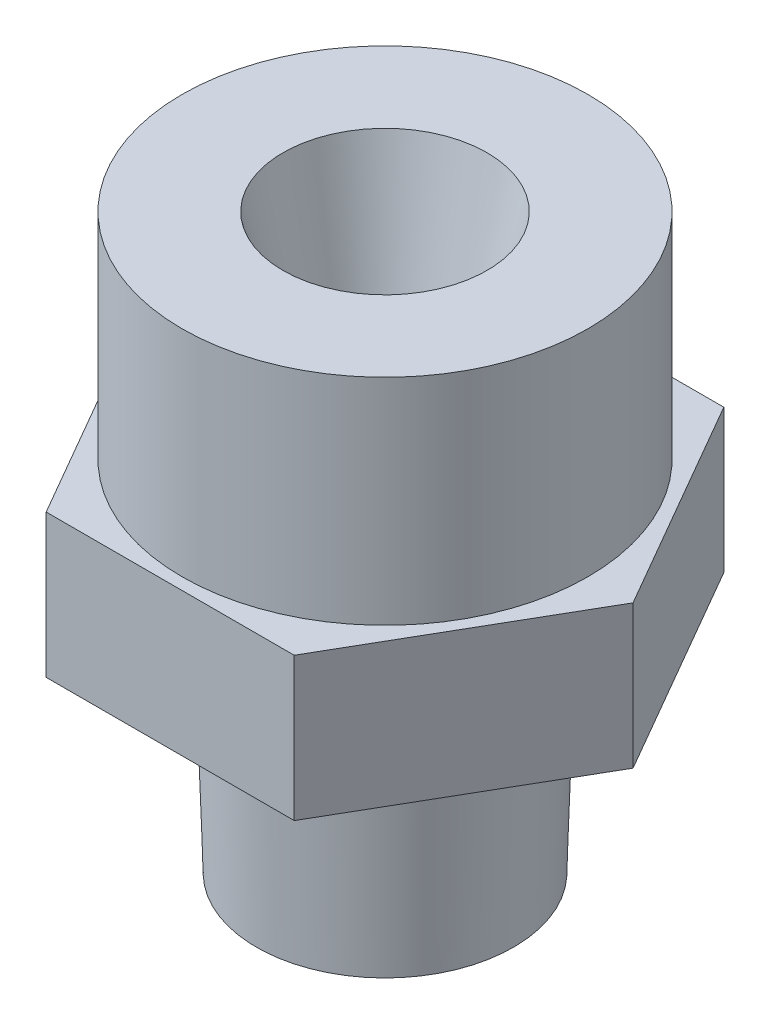
ISO-10303-21;
HEADER;
FILE_DESCRIPTION(('STEP AP214'),'2;1');
FILE_NAME('part.step','',(''),(''),'','','');
FILE_SCHEMA(('AUTOMOTIVE_DESIGN { 1 0 10303 214 1 1 1 1 }'));
ENDSEC;
DATA;
#1=APPLICATION_CONTEXT('core data for automotive mechanical design processes');
#2=APPLICATION_PROTOCOL_DEFINITION('international standard','automotive_design',2000,#1);
#3=PRODUCT_CONTEXT('',#1,'mechanical');
#4=PRODUCT('Part','Part','',(#3));
#5=PRODUCT_RELATED_PRODUCT_CATEGORY('part','',(#4));
#6=PRODUCT_DEFINITION_FORMATION('','',#4);
#7=PRODUCT_DEFINITION_CONTEXT('part definition',#1,'design');
#8=PRODUCT_DEFINITION('design','',#6,#7);
#9=PRODUCT_DEFINITION_SHAPE('','',#8);
#10=(LENGTH_UNIT() NAMED_UNIT(*) SI_UNIT(.MILLI.,.METRE.));
#11=(NAMED_UNIT(*) PLANE_ANGLE_UNIT() SI_UNIT($,.RADIAN.));
#12=(NAMED_UNIT(*) SI_UNIT($,.STERADIAN.) SOLID_ANGLE_UNIT());
#13=UNCERTAINTY_MEASURE_WITH_UNIT(LENGTH_MEASURE(1.E-05),#10,'distance_accuracy_value','');
#14=(GEOMETRIC_REPRESENTATION_CONTEXT(3) GLOBAL_UNCERTAINTY_ASSIGNED_CONTEXT((#13)) GLOBAL_UNIT_ASSIGNED_CONTEXT((#10,
#11,#12)) REPRESENTATION_CONTEXT('',''));
#15=CARTESIAN_POINT('',(0.,0.,0.));
#16=DIRECTION('',(0.,0.,1.));
#17=DIRECTION('',(1.,0.,0.));
#18=AXIS2_PLACEMENT_3D('',#15,#16,#17);
#19=CARTESIAN_POINT('',(0.,9.525,0.));
#20=DIRECTION('',(0.,-1.,0.));
#21=DIRECTION('',(0.,0.,-1.));
#22=AXIS2_PLACEMENT_3D('',#19,#20,#21);
#23=CYLINDRICAL_SURFACE('',#22,9.);
#24=CARTESIAN_POINT('',(0.,9.525,0.));
#25=DIRECTION('',(0.,1.,0.));
#26=DIRECTION('',(0.,0.,1.));
#27=AXIS2_PLACEMENT_3D('',#24,#25,#26);
#28=CIRCLE('',#27,9.);
#29=CARTESIAN_POINT('',(0.,9.525,-9.));
#30=VERTEX_POINT('',#29);
#31=EDGE_CURVE('E11',#30,#30,#28,.T.);
#32=CARTESIAN_POINT('',(0.,0.,0.));
#33=DIRECTION('',(0.,1.,0.));
#34=DIRECTION('',(0.,0.,1.));
#35=AXIS2_PLACEMENT_3D('',#32,#33,#34);
#36=CIRCLE('',#35,9.);
#37=CARTESIAN_POINT('',(0.,0.,-9.));
#38=VERTEX_POINT('',#37);
#39=EDGE_CURVE('E42',#38,#38,#36,.T.);
#40=CARTESIAN_POINT('',(0.,9.525,-9.));
#41=CARTESIAN_POINT('',(0.,9.42578125,-9.));
#42=CARTESIAN_POINT('',(0.,9.3265625,-9.));
#43=CARTESIAN_POINT('',(0.,9.128125,-9.));
#44=CARTESIAN_POINT('',(0.,9.02890625,-9.));
#45=CARTESIAN_POINT('',(0.,8.83046875,-9.));
#46=CARTESIAN_POINT('',(0.,8.73125,-9.));
#47=CARTESIAN_POINT('',(0.,8.5328125,-9.));
#48=CARTESIAN_POINT('',(0.,8.43359375,-9.));
#49=CARTESIAN_POINT('',(0.,8.23515625,-9.));
#50=CARTESIAN_POINT('',(0.,8.1359375,-9.));
#51=CARTESIAN_POINT('',(0.,7.9375,-9.));
#52=CARTESIAN_POINT('',(0.,7.83828125,-9.));
#53=CARTESIAN_POINT('',(0.,7.63984375,-9.));
#54=CARTESIAN_POINT('',(0.,7.540625,-9.));
#55=CARTESIAN_POINT('',(0.,7.3421875,-9.));
#56=CARTESIAN_POINT('',(0.,7.24296875,-9.));
#57=CARTESIAN_POINT('',(0.,7.04453125,-9.));
#58=CARTESIAN_POINT('',(0.,6.9453125,-9.));
#59=CARTESIAN_POINT('',(0.,6.746875,-9.));
#60=CARTESIAN_POINT('',(0.,6.64765625,-9.));
#61=CARTESIAN_POINT('',(0.,6.44921875,-9.));
#62=CARTESIAN_POINT('',(0.,6.35,-9.));
#63=CARTESIAN_POINT('',(0.,6.1515625,-9.));
#64=CARTESIAN_POINT('',(0.,6.05234375,-9.));
#65=CARTESIAN_POINT('',(0.,5.85390625,-9.));
#66=CARTESIAN_POINT('',(0.,5.7546875,-9.));
#67=CARTESIAN_POINT('',(0.,5.55625,-9.));
#68=CARTESIAN_POINT('',(0.,5.45703125,-9.));
#69=CARTESIAN_POINT('',(0.,5.25859375,-9.));
#70=CARTESIAN_POINT('',(0.,5.159375,-9.));
#71=CARTESIAN_POINT('',(0.,4.9609375,-9.));
#72=CARTESIAN_POINT('',(0.,4.86171875,-9.));
#73=CARTESIAN_POINT('',(0.,4.66328125,-9.));
#74=CARTESIAN_POINT('',(0.,4.5640625,-9.));
#75=CARTESIAN_POINT('',(0.,4.365625,-9.));
#76=CARTESIAN_POINT('',(0.,4.26640625,-9.));
#77=CARTESIAN_POINT('',(0.,4.06796875,-9.));
#78=CARTESIAN_POINT('',(0.,3.96875,-9.));
#79=CARTESIAN_POINT('',(0.,3.7703125,-9.));
#80=CARTESIAN_POINT('',(0.,3.67109375,-9.));
#81=CARTESIAN_POINT('',(0.,3.47265625,-9.));
#82=CARTESIAN_POINT('',(0.,3.3734375,-9.));
#83=CARTESIAN_POINT('',(0.,3.175,-9.));
#84=CARTESIAN_POINT('',(0.,3.07578125,-9.));
#85=CARTESIAN_POINT('',(0.,2.87734375,-9.));
#86=CARTESIAN_POINT('',(0.,2.778125,-9.));
#87=CARTESIAN_POINT('',(0.,2.5796875,-9.));
#88=CARTESIAN_POINT('',(0.,2.48046875,-9.));
#89=CARTESIAN_POINT('',(0.,2.28203125,-9.));
#90=CARTESIAN_POINT('',(0.,2.1828125,-9.));
#91=CARTESIAN_POINT('',(0.,1.984375,-9.));
#92=CARTESIAN_POINT('',(0.,1.88515625,-9.));
#93=CARTESIAN_POINT('',(0.,1.68671875,-9.));
#94=CARTESIAN_POINT('',(0.,1.5875,-9.));
#95=CARTESIAN_POINT('',(0.,1.3890625,-9.));
#96=CARTESIAN_POINT('',(0.,1.28984375,-9.));
#97=CARTESIAN_POINT('',(0.,1.09140625,-9.));
#98=CARTESIAN_POINT('',(0.,0.992187500000001,-9.));
#99=CARTESIAN_POINT('',(0.,0.793750000000001,-9.));
#100=CARTESIAN_POINT('',(0.,0.69453125,-9.));
#101=CARTESIAN_POINT('',(0.,0.49609375,-9.));
#102=CARTESIAN_POINT('',(0.,0.396875,-9.));
#103=CARTESIAN_POINT('',(0.,0.1984375,-9.));
#104=CARTESIAN_POINT('',(0.,0.0992187500000001,-9.));
#105=CARTESIAN_POINT('',(0.,0.,-9.));
#106=B_SPLINE_CURVE_WITH_KNOTS('',3,(#40,#41,#42,#43,#44,#45,#46,#47,#48,#49,#50,#51,#52,#53,
#54,#55,#56,#57,#58,#59,#60,#61,#62,#63,#64,#65,#66,#67,#68,#69,#70,#71,#72,#73,#74,#75,#76,#77,
#78,#79,#80,#81,#82,#83,#84,#85,#86,#87,#88,#89,#90,#91,#92,#93,#94,#95,#96,#97,#98,#99,#100,
#101,#102,#103,#104,#105),.UNSPECIFIED.,.F.,.F.,(4,2,2,2,2,2,2,2,2,2,2,2,2,2,2,2,2,2,2,2,2,2,2,
2,2,2,2,2,2,2,2,2,4),(0.,0.297656249999998,0.595312499999999,0.892968749999999,1.190625,
1.48828125,1.7859375,2.08359375,2.38125,2.67890625,2.9765625,3.27421875,3.571875,3.86953125,
4.1671875,4.46484375,4.7625,5.06015625,5.3578125,5.65546875,5.953125,6.25078125,6.5484375,
6.84609375,7.14375,7.44140625,7.7390625,8.03671875,8.334375,8.63203125,8.9296875,9.22734375,
9.525),.UNSPECIFIED.);
#107=EDGE_CURVE('BSEAM39',#30,#38,#106,.T.);
#108=ORIENTED_EDGE('',*,*,#31,.F.);
#109=ORIENTED_EDGE('',*,*,#39,.T.);
#110=ORIENTED_EDGE('',*,*,#107,.T.);
#111=ORIENTED_EDGE('',*,*,#107,.F.);
#112=EDGE_LOOP('',(#108,#110,#109,#111));
#113=FACE_BOUND('',#112,.T.);
#114=ADVANCED_FACE('F39',(#113),#23,.T.);
#115=CARTESIAN_POINT('',(0.,9.525,0.));
#116=DIRECTION('',(0.,1.,0.));
#117=DIRECTION('',(0.,0.,1.));
#118=AXIS2_PLACEMENT_3D('',#115,#116,#117);
#119=PLANE('',#118);
#120=CARTESIAN_POINT('',(0.,9.525,0.));
#121=DIRECTION('',(0.,-1.,0.));
#122=DIRECTION('',(0.,0.,-1.));
#123=AXIS2_PLACEMENT_3D('',#120,#121,#122);
#124=CIRCLE('',#123,4.52473416660464);
#125=CARTESIAN_POINT('',(0.,9.525,-4.52473416660464));
#126=VERTEX_POINT('',#125);
#127=EDGE_CURVE('E49',#126,#126,#124,.T.);
#128=ORIENTED_EDGE('',*,*,#127,.T.);
#129=EDGE_LOOP('',(#128));
#130=FACE_BOUND('',#129,.T.);
#131=ORIENTED_EDGE('',*,*,#31,.T.);
#132=EDGE_LOOP('',(#131));
#133=FACE_BOUND('',#132,.T.);
#134=ADVANCED_FACE('F169',(#130,#133),#119,.T.);
#135=CARTESIAN_POINT('',(0.,3.175,0.));
#136=DIRECTION('',(0.,-1.,0.));
#137=DIRECTION('',(0.,0.,-1.));
#138=AXIS2_PLACEMENT_3D('',#135,#136,#137);
#139=CYLINDRICAL_SURFACE('',#138,3.175);
#140=CARTESIAN_POINT('',(0.,3.175,0.));
#141=DIRECTION('',(0.,-1.,0.));
#142=DIRECTION('',(0.,0.,-1.));
#143=AXIS2_PLACEMENT_3D('',#140,#141,#142);
#144=CIRCLE('',#143,3.175);
#145=CARTESIAN_POINT('',(0.,3.175,-3.175));
#146=VERTEX_POINT('',#145);
#147=EDGE_CURVE('E161',#146,#146,#144,.T.);
#148=ORIENTED_EDGE('',*,*,#147,.F.);
#149=EDGE_LOOP('',(#148));
#150=FACE_BOUND('',#149,.T.);
#151=CARTESIAN_POINT('',(0.,-15.875,0.));
#152=DIRECTION('',(0.,-1.,0.));
#153=DIRECTION('',(0.,0.,-1.));
#154=AXIS2_PLACEMENT_3D('',#151,#152,#153);
#155=CIRCLE('',#154,3.175);
#156=CARTESIAN_POINT('',(0.,-15.875,-3.175));
#157=VERTEX_POINT('',#156);
#158=EDGE_CURVE('E184',#157,#157,#155,.T.);
#159=ORIENTED_EDGE('',*,*,#158,.T.);
#160=EDGE_LOOP('',(#159));
#161=FACE_BOUND('',#160,.T.);
#162=ADVANCED_FACE('F175',(#150,#161),#139,.F.);
#163=CARTESIAN_POINT('',(0.,3.175,0.));
#164=DIRECTION('',(0.,1.,0.));
#165=DIRECTION('',(0.,0.,-1.));
#166=AXIS2_PLACEMENT_3D('',#163,#164,#165);
#167=CONICAL_SURFACE('',#166,3.175,0.20943951023932);
#168=ORIENTED_EDGE('',*,*,#127,.F.);
#169=EDGE_LOOP('',(#168));
#170=FACE_BOUND('',#169,.T.);
#171=ORIENTED_EDGE('',*,*,#147,.T.);
#172=EDGE_LOOP('',(#171));
#173=FACE_BOUND('',#172,.T.);
#174=ADVANCED_FACE('F172',(#170,#173),#167,.F.);
#175=CARTESIAN_POINT('',(0.,-6.35,0.));
#176=DIRECTION('',(0.,-1.,0.));
#177=DIRECTION('',(0.,0.,-1.));
#178=AXIS2_PLACEMENT_3D('',#175,#176,#177);
#179=PLANE('',#178);
#180=CARTESIAN_POINT('',(0.,-6.35,0.));
#181=DIRECTION('',(0.,-1.,0.));
#182=DIRECTION('',(0.,0.,-1.));
#183=AXIS2_PLACEMENT_3D('',#180,#181,#182);
#184=CIRCLE('',#183,6.);
#185=CARTESIAN_POINT('',(0.,-6.35,-6.));
#186=VERTEX_POINT('',#185);
#187=EDGE_CURVE('E187',#186,#186,#184,.T.);
#188=ORIENTED_EDGE('',*,*,#187,.F.);
#189=EDGE_LOOP('',(#188));
#190=FACE_BOUND('',#189,.T.);
#191=DIRECTION('',(-0.5,0.,-0.866025403784439));
#192=VECTOR('',#191,1.);
#193=CARTESIAN_POINT('',(-5.49926131403119,-6.35,9.525));
#194=LINE('',#193,#192);
#195=CARTESIAN_POINT('',(-5.49926131403119,-6.35,9.525));
#196=VERTEX_POINT('',#195);
#197=CARTESIAN_POINT('',(-10.9985226280624,-6.35,0.));
#198=VERTEX_POINT('',#197);
#199=EDGE_CURVE('E147',#196,#198,#194,.T.);
#200=ORIENTED_EDGE('',*,*,#199,.T.);
#201=DIRECTION('',(0.5,0.,-0.866025403784439));
#202=VECTOR('',#201,1.);
#203=CARTESIAN_POINT('',(-10.9985226280624,-6.35,0.));
#204=LINE('',#203,#202);
#205=CARTESIAN_POINT('',(-5.49926131403119,-6.35,-9.525));
#206=VERTEX_POINT('',#205);
#207=EDGE_CURVE('E95',#198,#206,#204,.T.);
#208=ORIENTED_EDGE('',*,*,#207,.T.);
#209=DIRECTION('',(1.,0.,0.));
#210=VECTOR('',#209,1.);
#211=CARTESIAN_POINT('',(-5.49926131403119,-6.35,-9.525));
#212=LINE('',#211,#210);
#213=CARTESIAN_POINT('',(5.49926131403118,-6.35,-9.525));
#214=VERTEX_POINT('',#213);
#215=EDGE_CURVE('E108',#206,#214,#212,.T.);
#216=ORIENTED_EDGE('',*,*,#215,.T.);
#217=DIRECTION('',(0.5,0.,0.866025403784439));
#218=VECTOR('',#217,1.);
#219=CARTESIAN_POINT('',(5.49926131403118,-6.35,-9.525));
#220=LINE('',#219,#218);
#221=CARTESIAN_POINT('',(10.9985226280624,-6.35,0.));
#222=VERTEX_POINT('',#221);
#223=EDGE_CURVE('E102',#214,#222,#220,.T.);
#224=ORIENTED_EDGE('',*,*,#223,.T.);
#225=DIRECTION('',(-0.5,0.,0.866025403784439));
#226=VECTOR('',#225,1.);
#227=CARTESIAN_POINT('',(10.9985226280624,-6.35,0.));
#228=LINE('',#227,#226);
#229=CARTESIAN_POINT('',(5.49926131403119,-6.35,9.525));
#230=VERTEX_POINT('',#229);
#231=EDGE_CURVE('E106',#222,#230,#228,.T.);
#232=ORIENTED_EDGE('',*,*,#231,.T.);
#233=DIRECTION('',(-1.,0.,0.));
#234=VECTOR('',#233,1.);
#235=CARTESIAN_POINT('',(5.49926131403119,-6.35,9.525));
#236=LINE('',#235,#234);
#237=EDGE_CURVE('E57',#230,#196,#236,.T.);
#238=ORIENTED_EDGE('',*,*,#237,.T.);
#239=EDGE_LOOP('',(#200,#208,#216,#224,#232,#238));
#240=FACE_BOUND('',#239,.T.);
#241=ADVANCED_FACE('F104',(#190,#240),#179,.T.);
#242=CARTESIAN_POINT('',(0.,0.,0.));
#243=DIRECTION('',(0.,-1.,0.));
#244=DIRECTION('',(0.,0.,-1.));
#245=AXIS2_PLACEMENT_3D('',#242,#243,#244);
#246=PLANE('',#245);
#247=ORIENTED_EDGE('',*,*,#39,.F.);
#248=EDGE_LOOP('',(#247));
#249=FACE_BOUND('',#248,.T.);
#250=DIRECTION('',(-0.5,0.,-0.866025403784439));
#251=VECTOR('',#250,1.);
#252=CARTESIAN_POINT('',(-5.49926131403119,0.,9.525));
#253=LINE('',#252,#251);
#254=CARTESIAN_POINT('',(-5.49926131403119,0.,9.525));
#255=VERTEX_POINT('',#254);
#256=CARTESIAN_POINT('',(-10.9985226280624,0.,0.));
#257=VERTEX_POINT('',#256);
#258=EDGE_CURVE('E130',#255,#257,#253,.T.);
#259=ORIENTED_EDGE('',*,*,#258,.F.);
#260=DIRECTION('',(-1.,0.,0.));
#261=VECTOR('',#260,1.);
#262=CARTESIAN_POINT('',(5.49926131403119,0.,9.525));
#263=LINE('',#262,#261);
#264=CARTESIAN_POINT('',(5.49926131403119,0.,9.525));
#265=VERTEX_POINT('',#264);
#266=EDGE_CURVE('E86',#265,#255,#263,.T.);
#267=ORIENTED_EDGE('',*,*,#266,.F.);
#268=DIRECTION('',(-0.5,0.,0.866025403784439));
#269=VECTOR('',#268,1.);
#270=CARTESIAN_POINT('',(10.9985226280624,0.,0.));
#271=LINE('',#270,#269);
#272=CARTESIAN_POINT('',(10.9985226280624,0.,0.));
#273=VERTEX_POINT('',#272);
#274=EDGE_CURVE('E80',#273,#265,#271,.T.);
#275=ORIENTED_EDGE('',*,*,#274,.F.);
#276=DIRECTION('',(0.5,0.,0.866025403784439));
#277=VECTOR('',#276,1.);
#278=CARTESIAN_POINT('',(5.49926131403118,0.,-9.525));
#279=LINE('',#278,#277);
#280=CARTESIAN_POINT('',(5.49926131403118,0.,-9.525));
#281=VERTEX_POINT('',#280);
#282=EDGE_CURVE('E117',#281,#273,#279,.T.);
#283=ORIENTED_EDGE('',*,*,#282,.F.);
#284=DIRECTION('',(1.,0.,0.));
#285=VECTOR('',#284,1.);
#286=CARTESIAN_POINT('',(-5.49926131403119,0.,-9.525));
#287=LINE('',#286,#285);
#288=CARTESIAN_POINT('',(-5.49926131403119,0.,-9.525));
#289=VERTEX_POINT('',#288);
#290=EDGE_CURVE('E138',#289,#281,#287,.T.);
#291=ORIENTED_EDGE('',*,*,#290,.F.);
#292=DIRECTION('',(0.5,0.,-0.866025403784439));
#293=VECTOR('',#292,1.);
#294=CARTESIAN_POINT('',(-10.9985226280624,0.,0.));
#295=LINE('',#294,#293);
#296=EDGE_CURVE('E134',#257,#289,#295,.T.);
#297=ORIENTED_EDGE('',*,*,#296,.F.);
#298=EDGE_LOOP('',(#259,#267,#275,#283,#291,#297));
#299=FACE_BOUND('',#298,.T.);
#300=ADVANCED_FACE('F208',(#249,#299),#246,.F.);
#301=CARTESIAN_POINT('',(-5.49926131403119,-6.35,9.525));
#302=DIRECTION('',(0.866025403784439,0.,-0.5));
#303=DIRECTION('',(-0.5,0.,-0.866025403784439));
#304=AXIS2_PLACEMENT_3D('',#301,#302,#303);
#305=PLANE('',#304);
#306=ORIENTED_EDGE('',*,*,#258,.T.);
#307=DIRECTION('',(0.,1.,0.));
#308=VECTOR('',#307,1.);
#309=CARTESIAN_POINT('',(-10.9985226280624,-6.35,0.));
#310=LINE('',#309,#308);
#311=EDGE_CURVE('E158',#198,#257,#310,.T.);
#312=ORIENTED_EDGE('',*,*,#311,.F.);
#313=ORIENTED_EDGE('',*,*,#199,.F.);
#314=DIRECTION('',(0.,1.,0.));
#315=VECTOR('',#314,1.);
#316=CARTESIAN_POINT('',(-5.49926131403119,-6.35,9.525));
#317=LINE('',#316,#315);
#318=EDGE_CURVE('E126',#196,#255,#317,.T.);
#319=ORIENTED_EDGE('',*,*,#318,.T.);
#320=EDGE_LOOP('',(#306,#312,#313,#319));
#321=FACE_BOUND('',#320,.T.);
#322=ADVANCED_FACE('F210',(#321),#305,.F.);
#323=CARTESIAN_POINT('',(-10.9985226280624,-6.35,0.));
#324=DIRECTION('',(0.866025403784439,0.,0.5));
#325=DIRECTION('',(0.5,0.,-0.866025403784439));
#326=AXIS2_PLACEMENT_3D('',#323,#324,#325);
#327=PLANE('',#326);
#328=ORIENTED_EDGE('',*,*,#296,.T.);
#329=DIRECTION('',(0.,1.,0.));
#330=VECTOR('',#329,1.);
#331=CARTESIAN_POINT('',(-5.49926131403119,-6.35,-9.525));
#332=LINE('',#331,#330);
#333=EDGE_CURVE('E154',#206,#289,#332,.T.);
#334=ORIENTED_EDGE('',*,*,#333,.F.);
#335=ORIENTED_EDGE('',*,*,#207,.F.);
#336=ORIENTED_EDGE('',*,*,#311,.T.);
#337=EDGE_LOOP('',(#328,#334,#335,#336));
#338=FACE_BOUND('',#337,.T.);
#339=ADVANCED_FACE('F202',(#338),#327,.F.);
#340=CARTESIAN_POINT('',(-5.49926131403119,-6.35,-9.525));
#341=DIRECTION('',(0.,0.,1.));
#342=DIRECTION('',(1.,0.,0.));
#343=AXIS2_PLACEMENT_3D('',#340,#341,#342);
#344=PLANE('',#343);
#345=ORIENTED_EDGE('',*,*,#290,.T.);
#346=DIRECTION('',(0.,1.,0.));
#347=VECTOR('',#346,1.);
#348=CARTESIAN_POINT('',(5.49926131403118,-6.35,-9.525));
#349=LINE('',#348,#347);
#350=EDGE_CURVE('E119',#214,#281,#349,.T.);
#351=ORIENTED_EDGE('',*,*,#350,.F.);
#352=ORIENTED_EDGE('',*,*,#215,.F.);
#353=ORIENTED_EDGE('',*,*,#333,.T.);
#354=EDGE_LOOP('',(#345,#351,#352,#353));
#355=FACE_BOUND('',#354,.T.);
#356=ADVANCED_FACE('F205',(#355),#344,.F.);
#357=CARTESIAN_POINT('',(5.49926131403118,-6.35,-9.525));
#358=DIRECTION('',(-0.866025403784439,0.,0.5));
#359=DIRECTION('',(0.5,0.,0.866025403784439));
#360=AXIS2_PLACEMENT_3D('',#357,#358,#359);
#361=PLANE('',#360);
#362=ORIENTED_EDGE('',*,*,#282,.T.);
#363=DIRECTION('',(0.,1.,0.));
#364=VECTOR('',#363,1.);
#365=CARTESIAN_POINT('',(10.9985226280624,-6.35,0.));
#366=LINE('',#365,#364);
#367=EDGE_CURVE('E114',#222,#273,#366,.T.);
#368=ORIENTED_EDGE('',*,*,#367,.F.);
#369=ORIENTED_EDGE('',*,*,#223,.F.);
#370=ORIENTED_EDGE('',*,*,#350,.T.);
#371=EDGE_LOOP('',(#362,#368,#369,#370));
#372=FACE_BOUND('',#371,.T.);
#373=ADVANCED_FACE('F115',(#372),#361,.F.);
#374=CARTESIAN_POINT('',(10.9985226280624,-6.35,0.));
#375=DIRECTION('',(-0.866025403784439,0.,-0.5));
#376=DIRECTION('',(-0.5,0.,0.866025403784439));
#377=AXIS2_PLACEMENT_3D('',#374,#375,#376);
#378=PLANE('',#377);
#379=ORIENTED_EDGE('',*,*,#274,.T.);
#380=DIRECTION('',(0.,1.,0.));
#381=VECTOR('',#380,1.);
#382=CARTESIAN_POINT('',(5.49926131403119,-6.35,9.525));
#383=LINE('',#382,#381);
#384=EDGE_CURVE('E120',#230,#265,#383,.T.);
#385=ORIENTED_EDGE('',*,*,#384,.F.);
#386=ORIENTED_EDGE('',*,*,#231,.F.);
#387=ORIENTED_EDGE('',*,*,#367,.T.);
#388=EDGE_LOOP('',(#379,#385,#386,#387));
#389=FACE_BOUND('',#388,.T.);
#390=ADVANCED_FACE('F122',(#389),#378,.F.);
#391=CARTESIAN_POINT('',(5.49926131403119,-6.35,9.525));
#392=DIRECTION('',(0.,0.,-1.));
#393=DIRECTION('',(-1.,0.,0.));
#394=AXIS2_PLACEMENT_3D('',#391,#392,#393);
#395=PLANE('',#394);
#396=ORIENTED_EDGE('',*,*,#266,.T.);
#397=ORIENTED_EDGE('',*,*,#318,.F.);
#398=ORIENTED_EDGE('',*,*,#237,.F.);
#399=ORIENTED_EDGE('',*,*,#384,.T.);
#400=EDGE_LOOP('',(#396,#397,#398,#399));
#401=FACE_BOUND('',#400,.T.);
#402=ADVANCED_FACE('F211',(#401),#395,.F.);
#403=CARTESIAN_POINT('',(0.,-15.875,0.));
#404=DIRECTION('',(0.,-1.,0.));
#405=DIRECTION('',(0.,0.,-1.));
#406=AXIS2_PLACEMENT_3D('',#403,#404,#405);
#407=PLANE('',#406);
#408=ORIENTED_EDGE('',*,*,#158,.F.);
#409=EDGE_LOOP('',(#408));
#410=FACE_BOUND('',#409,.T.);
#411=CARTESIAN_POINT('',(0.,-15.875,0.));
#412=DIRECTION('',(0.,-1.,0.));
#413=DIRECTION('',(0.,0.,-1.));
#414=AXIS2_PLACEMENT_3D('',#411,#412,#413);
#415=CIRCLE('',#414,5.70232887476826);
#416=CARTESIAN_POINT('',(0.,-15.875,-5.70232887476826));
#417=VERTEX_POINT('',#416);
#418=EDGE_CURVE('E135',#417,#417,#415,.T.);
#419=ORIENTED_EDGE('',*,*,#418,.T.);
#420=EDGE_LOOP('',(#419));
#421=FACE_BOUND('',#420,.T.);
#422=ADVANCED_FACE('F213',(#410,#421),#407,.T.);
#423=CARTESIAN_POINT('',(0.,-6.35,0.));
#424=DIRECTION('',(0.,1.,0.));
#425=DIRECTION('',(0.,0.,-1.));
#426=AXIS2_PLACEMENT_3D('',#423,#424,#425);
#427=CONICAL_SURFACE('',#426,6.,0.0312413936106986);
#428=ORIENTED_EDGE('',*,*,#418,.F.);
#429=EDGE_LOOP('',(#428));
#430=FACE_BOUND('',#429,.T.);
#431=ORIENTED_EDGE('',*,*,#187,.T.);
#432=EDGE_LOOP('',(#431));
#433=FACE_BOUND('',#432,.T.);
#434=ADVANCED_FACE('F219',(#430,#433),#427,.T.);
#435=CLOSED_SHELL('',(#114,#134,#162,#174,#241,#300,#322,#339,#356,#373,#390,#402,#422,#434));
#436=MANIFOLD_SOLID_BREP('B2',#435);
#437=ADVANCED_BREP_SHAPE_REPRESENTATION('',(#18,#436),#14);
#438=SHAPE_DEFINITION_REPRESENTATION(#9,#437);
ENDSEC;
END-ISO-10303-21;
